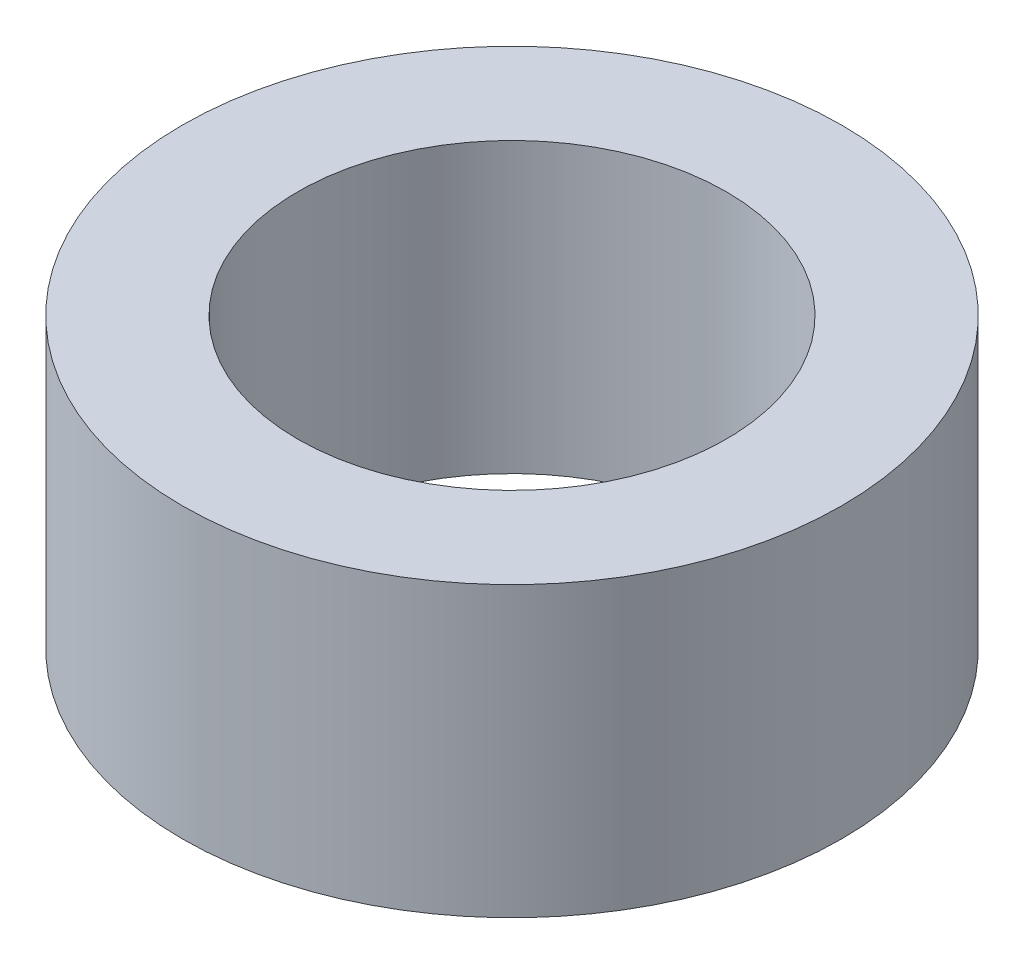
ISO-10303-21;
HEADER;
FILE_DESCRIPTION(('STEP AP214'),'2;1');
FILE_NAME('part.step','',(''),(''),'','','');
FILE_SCHEMA(('AUTOMOTIVE_DESIGN { 1 0 10303 214 1 1 1 1 }'));
ENDSEC;
DATA;
#1=APPLICATION_CONTEXT('core data for automotive mechanical design processes');
#2=APPLICATION_PROTOCOL_DEFINITION('international standard','automotive_design',2000,#1);
#3=PRODUCT_CONTEXT('',#1,'mechanical');
#4=PRODUCT('Part','Part','',(#3));
#5=PRODUCT_RELATED_PRODUCT_CATEGORY('part','',(#4));
#6=PRODUCT_DEFINITION_FORMATION('','',#4);
#7=PRODUCT_DEFINITION_CONTEXT('part definition',#1,'design');
#8=PRODUCT_DEFINITION('design','',#6,#7);
#9=PRODUCT_DEFINITION_SHAPE('','',#8);
#10=(LENGTH_UNIT() NAMED_UNIT(*) SI_UNIT(.MILLI.,.METRE.));
#11=(NAMED_UNIT(*) PLANE_ANGLE_UNIT() SI_UNIT($,.RADIAN.));
#12=(NAMED_UNIT(*) SI_UNIT($,.STERADIAN.) SOLID_ANGLE_UNIT());
#13=UNCERTAINTY_MEASURE_WITH_UNIT(LENGTH_MEASURE(1.E-05),#10,'distance_accuracy_value','');
#14=(GEOMETRIC_REPRESENTATION_CONTEXT(3) GLOBAL_UNCERTAINTY_ASSIGNED_CONTEXT((#13)) GLOBAL_UNIT_ASSIGNED_CONTEXT((#10,
#11,#12)) REPRESENTATION_CONTEXT('',''));
#15=CARTESIAN_POINT('',(0.,0.,0.));
#16=DIRECTION('',(0.,0.,1.));
#17=DIRECTION('',(1.,0.,0.));
#18=AXIS2_PLACEMENT_3D('',#15,#16,#17);
#19=CARTESIAN_POINT('',(0.,3.5,0.));
#20=DIRECTION('',(0.,1.,0.));
#21=DIRECTION('',(0.,0.,1.));
#22=AXIS2_PLACEMENT_3D('',#19,#20,#21);
#23=PLANE('',#22);
#24=CARTESIAN_POINT('',(0.,3.5,0.));
#25=DIRECTION('',(0.,1.,0.));
#26=DIRECTION('',(0.,0.,1.));
#27=AXIS2_PLACEMENT_3D('',#24,#25,#26);
#28=CIRCLE('',#27,4.);
#29=CARTESIAN_POINT('',(0.,3.5,4.));
#30=VERTEX_POINT('',#29);
#31=EDGE_CURVE('E10',#30,#30,#28,.T.);
#32=ORIENTED_EDGE('',*,*,#31,.T.);
#33=EDGE_LOOP('',(#32));
#34=FACE_BOUND('',#33,.T.);
#35=CARTESIAN_POINT('',(0.,3.5,0.));
#36=DIRECTION('',(0.,1.,0.));
#37=DIRECTION('',(0.,0.,1.));
#38=AXIS2_PLACEMENT_3D('',#35,#36,#37);
#39=CIRCLE('',#38,2.6);
#40=CARTESIAN_POINT('',(0.,3.5,2.6));
#41=VERTEX_POINT('',#40);
#42=EDGE_CURVE('E44',#41,#41,#39,.T.);
#43=ORIENTED_EDGE('',*,*,#42,.F.);
#44=EDGE_LOOP('',(#43));
#45=FACE_BOUND('',#44,.T.);
#46=ADVANCED_FACE('F33',(#34,#45),#23,.T.);
#47=CARTESIAN_POINT('',(0.,0.,0.));
#48=DIRECTION('',(0.,1.,0.));
#49=DIRECTION('',(0.,0.,1.));
#50=AXIS2_PLACEMENT_3D('',#47,#48,#49);
#51=PLANE('',#50);
#52=CARTESIAN_POINT('',(0.,0.,0.));
#53=DIRECTION('',(0.,1.,0.));
#54=DIRECTION('',(0.,0.,1.));
#55=AXIS2_PLACEMENT_3D('',#52,#53,#54);
#56=CIRCLE('',#55,4.);
#57=CARTESIAN_POINT('',(0.,0.,4.));
#58=VERTEX_POINT('',#57);
#59=EDGE_CURVE('E37',#58,#58,#56,.T.);
#60=ORIENTED_EDGE('',*,*,#59,.F.);
#61=EDGE_LOOP('',(#60));
#62=FACE_BOUND('',#61,.T.);
#63=CARTESIAN_POINT('',(0.,0.,0.));
#64=DIRECTION('',(0.,1.,0.));
#65=DIRECTION('',(0.,0.,1.));
#66=AXIS2_PLACEMENT_3D('',#63,#64,#65);
#67=CIRCLE('',#66,2.6);
#68=CARTESIAN_POINT('',(0.,0.,2.6));
#69=VERTEX_POINT('',#68);
#70=EDGE_CURVE('E46',#69,#69,#67,.T.);
#71=ORIENTED_EDGE('',*,*,#70,.T.);
#72=EDGE_LOOP('',(#71));
#73=FACE_BOUND('',#72,.T.);
#74=ADVANCED_FACE('F56',(#62,#73),#51,.F.);
#75=CARTESIAN_POINT('',(0.,3.5,0.));
#76=DIRECTION('',(0.,-1.,0.));
#77=DIRECTION('',(0.,0.,-1.));
#78=AXIS2_PLACEMENT_3D('',#75,#76,#77);
#79=CYLINDRICAL_SURFACE('',#78,4.);
#80=ORIENTED_EDGE('',*,*,#31,.F.);
#81=EDGE_LOOP('',(#80));
#82=FACE_BOUND('',#81,.T.);
#83=ORIENTED_EDGE('',*,*,#59,.T.);
#84=EDGE_LOOP('',(#83));
#85=FACE_BOUND('',#84,.T.);
#86=ADVANCED_FACE('F35',(#82,#85),#79,.T.);
#87=CARTESIAN_POINT('',(0.,3.5,0.));
#88=DIRECTION('',(0.,-1.,0.));
#89=DIRECTION('',(0.,0.,-1.));
#90=AXIS2_PLACEMENT_3D('',#87,#88,#89);
#91=CYLINDRICAL_SURFACE('',#90,2.6);
#92=ORIENTED_EDGE('',*,*,#42,.T.);
#93=EDGE_LOOP('',(#92));
#94=FACE_BOUND('',#93,.T.);
#95=ORIENTED_EDGE('',*,*,#70,.F.);
#96=EDGE_LOOP('',(#95));
#97=FACE_BOUND('',#96,.T.);
#98=ADVANCED_FACE('F52',(#94,#97),#91,.F.);
#99=CLOSED_SHELL('',(#46,#74,#86,#98));
#100=MANIFOLD_SOLID_BREP('B2',#99);
#101=ADVANCED_BREP_SHAPE_REPRESENTATION('',(#18,#100),#14);
#102=SHAPE_DEFINITION_REPRESENTATION(#9,#101);
ENDSEC;
END-ISO-10303-21;
